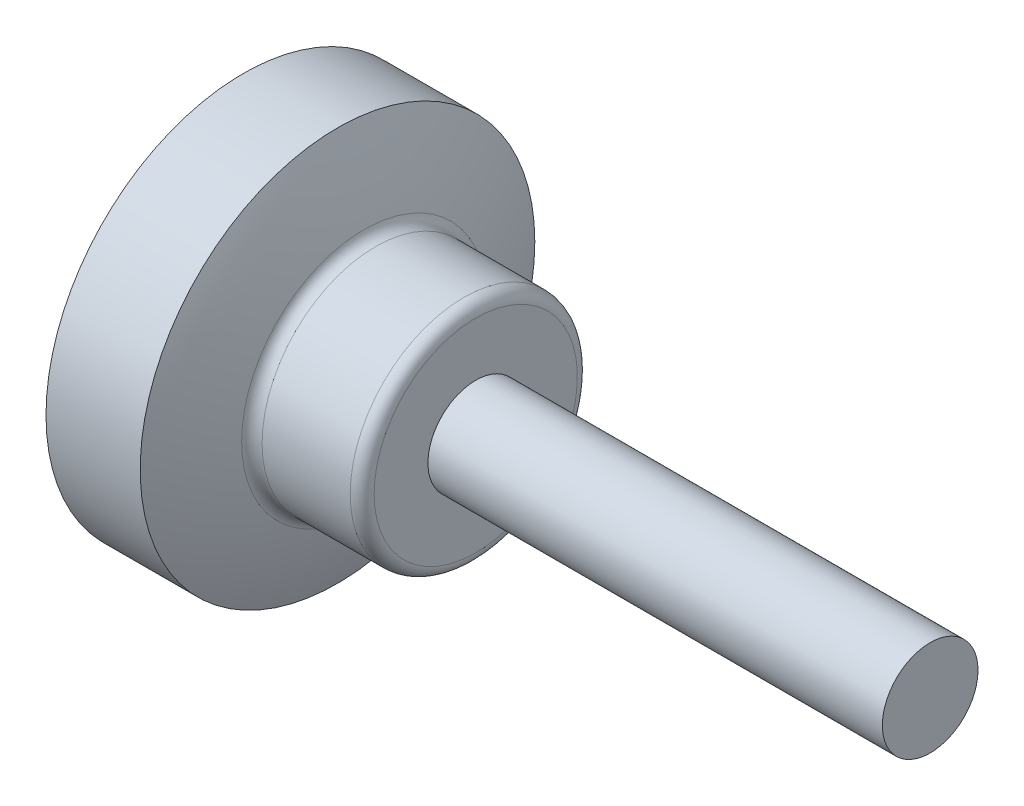
ISO-10303-21;
HEADER;
FILE_DESCRIPTION(('STEP AP214'),'2;1');
FILE_NAME('part.step','',(''),(''),'','','');
FILE_SCHEMA(('AUTOMOTIVE_DESIGN { 1 0 10303 214 1 1 1 1 }'));
ENDSEC;
DATA;
#1=APPLICATION_CONTEXT('core data for automotive mechanical design processes');
#2=APPLICATION_PROTOCOL_DEFINITION('international standard','automotive_design',2000,#1);
#3=PRODUCT_CONTEXT('',#1,'mechanical');
#4=PRODUCT('Part','Part','',(#3));
#5=PRODUCT_RELATED_PRODUCT_CATEGORY('part','',(#4));
#6=PRODUCT_DEFINITION_FORMATION('','',#4);
#7=PRODUCT_DEFINITION_CONTEXT('part definition',#1,'design');
#8=PRODUCT_DEFINITION('design','',#6,#7);
#9=PRODUCT_DEFINITION_SHAPE('','',#8);
#10=(LENGTH_UNIT() NAMED_UNIT(*) SI_UNIT(.MILLI.,.METRE.));
#11=(NAMED_UNIT(*) PLANE_ANGLE_UNIT() SI_UNIT($,.RADIAN.));
#12=(NAMED_UNIT(*) SI_UNIT($,.STERADIAN.) SOLID_ANGLE_UNIT());
#13=UNCERTAINTY_MEASURE_WITH_UNIT(LENGTH_MEASURE(1.E-05),#10,'distance_accuracy_value','');
#14=(GEOMETRIC_REPRESENTATION_CONTEXT(3) GLOBAL_UNCERTAINTY_ASSIGNED_CONTEXT((#13)) GLOBAL_UNIT_ASSIGNED_CONTEXT((#10,
#11,#12)) REPRESENTATION_CONTEXT('',''));
#15=CARTESIAN_POINT('',(0.,0.,0.));
#16=DIRECTION('',(0.,0.,1.));
#17=DIRECTION('',(1.,0.,0.));
#18=AXIS2_PLACEMENT_3D('',#15,#16,#17);
#19=CARTESIAN_POINT('',(61.,0.,0.));
#20=DIRECTION('',(-1.,0.,0.));
#21=DIRECTION('',(0.,0.,1.));
#22=AXIS2_PLACEMENT_3D('',#19,#20,#21);
#23=CYLINDRICAL_SURFACE('',#22,4.);
#24=CARTESIAN_POINT('',(61.,0.,0.));
#25=DIRECTION('',(1.,0.,0.));
#26=DIRECTION('',(0.,0.,-1.));
#27=AXIS2_PLACEMENT_3D('',#24,#25,#26);
#28=CIRCLE('',#27,4.);
#29=CARTESIAN_POINT('',(61.,0.,-4.));
#30=VERTEX_POINT('',#29);
#31=EDGE_CURVE('E11',#30,#30,#28,.T.);
#32=ORIENTED_EDGE('',*,*,#31,.F.);
#33=EDGE_LOOP('',(#32));
#34=FACE_BOUND('',#33,.T.);
#35=CARTESIAN_POINT('',(23.,0.,0.));
#36=DIRECTION('',(1.,0.,0.));
#37=DIRECTION('',(0.,0.,-1.));
#38=AXIS2_PLACEMENT_3D('',#35,#36,#37);
#39=CIRCLE('',#38,4.);
#40=CARTESIAN_POINT('',(23.,0.,-4.));
#41=VERTEX_POINT('',#40);
#42=EDGE_CURVE('E44',#41,#41,#39,.T.);
#43=ORIENTED_EDGE('',*,*,#42,.T.);
#44=EDGE_LOOP('',(#43));
#45=FACE_BOUND('',#44,.T.);
#46=ADVANCED_FACE('F41',(#34,#45),#23,.T.);
#47=CARTESIAN_POINT('',(61.,0.,0.));
#48=DIRECTION('',(1.,0.,0.));
#49=DIRECTION('',(0.,0.,-1.));
#50=AXIS2_PLACEMENT_3D('',#47,#48,#49);
#51=PLANE('',#50);
#52=ORIENTED_EDGE('',*,*,#31,.T.);
#53=EDGE_LOOP('',(#52));
#54=FACE_BOUND('',#53,.T.);
#55=ADVANCED_FACE('F56',(#54),#51,.T.);
#56=CARTESIAN_POINT('',(23.,0.,0.));
#57=DIRECTION('',(1.,0.,0.));
#58=DIRECTION('',(0.,0.,-1.));
#59=AXIS2_PLACEMENT_3D('',#56,#57,#58);
#60=PLANE('',#59);
#61=ORIENTED_EDGE('',*,*,#42,.F.);
#62=EDGE_LOOP('',(#61));
#63=FACE_BOUND('',#62,.T.);
#64=ADVANCED_FACE('F54',(#63),#60,.F.);
#65=CLOSED_SHELL('',(#46,#55,#64));
#66=MANIFOLD_SOLID_BREP('B2',#65);
#67=CARTESIAN_POINT('',(40.,0.,0.));
#68=DIRECTION('',(-1.,0.,0.));
#69=DIRECTION('',(0.,0.,-1.));
#70=AXIS2_PLACEMENT_3D('',#67,#68,#69);
#71=SPHERICAL_SURFACE('',#70,40.);
#72=CARTESIAN_POINT('',(3.5616959779959,0.,0.));
#73=DIRECTION('',(-1.,0.,0.));
#74=DIRECTION('',(0.,0.,1.));
#75=AXIS2_PLACEMENT_3D('',#72,#73,#74);
#76=CIRCLE('',#75,16.5);
#77=CARTESIAN_POINT('',(3.5616959779959,0.,16.5));
#78=VERTEX_POINT('',#77);
#79=EDGE_CURVE('E40',#78,#78,#76,.T.);
#80=ORIENTED_EDGE('',*,*,#79,.T.);
#81=EDGE_LOOP('',(#80));
#82=FACE_BOUND('',#81,.T.);
#83=ADVANCED_FACE('F82',(#82),#71,.T.);
#84=CARTESIAN_POINT('',(0.,0.,0.));
#85=DIRECTION('',(-1.,0.,0.));
#86=DIRECTION('',(0.,0.,1.));
#87=AXIS2_PLACEMENT_3D('',#84,#85,#86);
#88=CYLINDRICAL_SURFACE('',#87,16.5);
#89=ORIENTED_EDGE('',*,*,#79,.F.);
#90=EDGE_LOOP('',(#89));
#91=FACE_BOUND('',#90,.T.);
#92=CARTESIAN_POINT('',(11.4383040220041,0.,0.));
#93=DIRECTION('',(-1.,0.,0.));
#94=DIRECTION('',(0.,0.,1.));
#95=AXIS2_PLACEMENT_3D('',#92,#93,#94);
#96=CIRCLE('',#95,16.5);
#97=CARTESIAN_POINT('',(11.4383040220041,0.,-16.5));
#98=VERTEX_POINT('',#97);
#99=EDGE_CURVE('E88',#98,#98,#96,.T.);
#100=ORIENTED_EDGE('',*,*,#99,.T.);
#101=EDGE_LOOP('',(#100));
#102=FACE_BOUND('',#101,.T.);
#103=ADVANCED_FACE('F120',(#91,#102),#88,.T.);
#104=CARTESIAN_POINT('',(-25.,0.,0.));
#105=DIRECTION('',(-1.,0.,0.));
#106=DIRECTION('',(0.,0.,-1.));
#107=AXIS2_PLACEMENT_3D('',#104,#105,#106);
#108=SPHERICAL_SURFACE('',#107,40.);
#109=CARTESIAN_POINT('',(13.6660375888162,0.,0.));
#110=DIRECTION('',(-1.,0.,0.));
#111=DIRECTION('',(0.,0.,1.));
#112=AXIS2_PLACEMENT_3D('',#109,#110,#111);
#113=CIRCLE('',#112,10.2439024390244);
#114=CARTESIAN_POINT('',(13.6660375888162,0.,-10.2439024390243));
#115=VERTEX_POINT('',#114);
#116=EDGE_CURVE('E92',#115,#115,#113,.T.);
#117=CARTESIAN_POINT('',(11.4383040220041,0.,-16.5));
#118=CARTESIAN_POINT('',(11.4668720150123,0.,-16.4369109609196));
#119=CARTESIAN_POINT('',(11.4952761569736,0.,-16.3737477267931));
#120=CARTESIAN_POINT('',(11.5517559794634,0.,-16.2472745756783));
#121=CARTESIAN_POINT('',(11.5798316599918,0.,-16.1839646586899));
#122=CARTESIAN_POINT('',(11.6356538002768,0.,-16.0571998490816));
#123=CARTESIAN_POINT('',(11.6634002600334,0.,-15.9937449564616));
#124=CARTESIAN_POINT('',(11.7185632106921,0.,-15.8666919077922));
#125=CARTESIAN_POINT('',(11.7459797015944,0.,-15.8030937517427));
#126=CARTESIAN_POINT('',(11.8004819747283,0.,-15.6757558919973));
#127=CARTESIAN_POINT('',(11.8275677569601,0.,-15.6120161883013));
#128=CARTESIAN_POINT('',(11.8814078820295,0.,-15.4843969529411));
#129=CARTESIAN_POINT('',(11.9081622248673,0.,-15.4205174212768));
#130=CARTESIAN_POINT('',(11.9613387493218,0.,-15.2926202534101));
#131=CARTESIAN_POINT('',(11.9877609309385,0.,-15.2286026172077));
#132=CARTESIAN_POINT('',(12.0402724200977,0.,-15.1004309674263));
#133=CARTESIAN_POINT('',(12.0663617276402,0.,-15.0362769538474));
#134=CARTESIAN_POINT('',(12.118206764775,0.,-14.9078342801525));
#135=CARTESIAN_POINT('',(12.1439624943673,0.,-14.8435456200366));
#136=CARTESIAN_POINT('',(12.1951396807268,0.,-14.7148353877405));
#137=CARTESIAN_POINT('',(12.2205611374938,0.,-14.6504138155603));
#138=CARTESIAN_POINT('',(12.2710690923458,0.,-14.5214394971939));
#139=CARTESIAN_POINT('',(12.2961555904306,0.,-14.4568867510078));
#140=CARTESIAN_POINT('',(12.3459929510983,0.,-14.3276518262271));
#141=CARTESIAN_POINT('',(12.3707438136812,0.,-14.2629696476325));
#142=CARTESIAN_POINT('',(12.4199092355801,0.,-14.1334776031244));
#143=CARTESIAN_POINT('',(12.4443237948963,0.,-14.0686677372109));
#144=CARTESIAN_POINT('',(12.4928159515706,0.,-13.9389220665992));
#145=CARTESIAN_POINT('',(12.5168935489288,0.,-13.8739862619011));
#146=CARTESIAN_POINT('',(12.5647111320868,0.,-13.7439904656525));
#147=CARTESIAN_POINT('',(12.5884511178867,0.,-13.678930474102));
#148=CARTESIAN_POINT('',(12.6355928374365,0.,-13.5486880594312));
#149=CARTESIAN_POINT('',(12.6589945711864,0.,-13.4835056363109));
#150=CARTESIAN_POINT('',(12.7054591552704,0.,-13.3530201170863));
#151=CARTESIAN_POINT('',(12.7285220056044,0.,-13.2877170209821));
#152=CARTESIAN_POINT('',(12.7743082006337,0.,-13.1569919176311));
#153=CARTESIAN_POINT('',(12.797031545329,0.,-13.0915699103843));
#154=CARTESIAN_POINT('',(12.8421381160174,0.,-12.960608749798));
#155=CARTESIAN_POINT('',(12.8645213420105,0.,-12.8950695964584));
#156=CARTESIAN_POINT('',(12.9089470714076,0.,-12.7638759118965));
#157=CARTESIAN_POINT('',(12.9309895748116,0.,-12.6982213806742));
#158=CARTESIAN_POINT('',(12.9747332643357,0.,-12.5667987116699));
#159=CARTESIAN_POINT('',(12.9964344504559,0.,-12.5010305738879));
#160=CARTESIAN_POINT('',(13.0394949199266,0.,-12.3693824661523));
#161=CARTESIAN_POINT('',(13.060854203277,0.,-12.3035024961987));
#162=CARTESIAN_POINT('',(13.1032302909464,0.,-12.1716325015251));
#163=CARTESIAN_POINT('',(13.1242470952653,0.,-12.105642476805));
#164=CARTESIAN_POINT('',(13.1659376578501,0.,-11.973554152973));
#165=CARTESIAN_POINT('',(13.1866114161159,0.,-11.907455853861));
#166=CARTESIAN_POINT('',(13.2276153288275,0.,-11.7751527645405));
#167=CARTESIAN_POINT('',(13.2479454832733,0.,-11.7089479743321));
#168=CARTESIAN_POINT('',(13.2882616398493,0.,-11.5764336889877));
#169=CARTESIAN_POINT('',(13.3082476419796,0.,-11.5101241938518));
#170=CARTESIAN_POINT('',(13.3478749547105,0.,-11.3774022876452));
#171=CARTESIAN_POINT('',(13.3675162653111,0.,-11.3109898765745));
#172=CARTESIAN_POINT('',(13.4064536650812,0.,-11.1780639302715));
#173=CARTESIAN_POINT('',(13.4257497542507,0.,-11.1115503950391));
#174=CARTESIAN_POINT('',(13.4639961905227,0.,-10.9784239949007));
#175=CARTESIAN_POINT('',(13.4829465376252,0.,-10.9118111299947));
#176=CARTESIAN_POINT('',(13.5205009786353,0.,-10.7784878677258));
#177=CARTESIAN_POINT('',(13.539105072543,0.,-10.711777470363));
#178=CARTESIAN_POINT('',(13.5759665047048,0.,-10.5782609428467));
#179=CARTESIAN_POINT('',(13.594223842959,0.,-10.5114548126933));
#180=CARTESIAN_POINT('',(13.6303912732208,0.,-10.3777486225237));
#181=CARTESIAN_POINT('',(13.6483013652285,0.,-10.3108485625077));
#182=CARTESIAN_POINT('',(13.6660375888162,0.,-10.2439024390243));
#183=B_SPLINE_CURVE_WITH_KNOTS('',3,(#117,#118,#119,#120,#121,#122,#123,#124,#125,#126,#127,
#128,#129,#130,#131,#132,#133,#134,#135,#136,#137,#138,#139,#140,#141,#142,#143,#144,#145,#146,
#147,#148,#149,#150,#151,#152,#153,#154,#155,#156,#157,#158,#159,#160,#161,#162,#163,#164,#165,
#166,#167,#168,#169,#170,#171,#172,#173,#174,#175,#176,#177,#178,#179,#180,#181,#182),
.UNSPECIFIED.,.F.,.F.,(4,2,2,2,2,2,2,2,2,2,2,2,2,2,2,2,2,2,2,2,2,2,2,2,2,2,2,2,2,2,2,2,4),(0.,
0.207766976745709,0.415533953491422,0.623300930237129,0.831067906982841,1.03883488372856,
1.24660186047427,1.45436883721998,1.66213581396569,1.8699027907114,2.07766976745711,
2.28543674420282,2.49320372094853,2.70097069769424,2.90873767443995,3.11650465118566,
3.32427162793137,3.53203860467708,3.73980558142279,3.9475725581685,4.15533953491421,
4.36310651165993,4.57087348840564,4.77864046515135,4.98640744189706,5.19417441864277,
5.40194139538848,5.60970837213419,5.81747534887991,6.02524232562562,6.23300930237133,
6.44077627911704,6.64854325586275),.UNSPECIFIED.);
#184=EDGE_CURVE('BSEAM124',#98,#115,#183,.T.);
#185=ORIENTED_EDGE('',*,*,#99,.F.);
#186=ORIENTED_EDGE('',*,*,#116,.T.);
#187=ORIENTED_EDGE('',*,*,#184,.T.);
#188=ORIENTED_EDGE('',*,*,#184,.F.);
#189=EDGE_LOOP('',(#185,#187,#186,#188));
#190=FACE_BOUND('',#189,.T.);
#191=ADVANCED_FACE('F124',(#190),#108,.T.);
#192=CARTESIAN_POINT('',(14.6326885285367,0.,0.));
#193=DIRECTION('',(-1.,0.,0.));
#194=DIRECTION('',(0.,0.,1.));
#195=AXIS2_PLACEMENT_3D('',#192,#193,#194);
#196=TOROIDAL_SURFACE('',#195,10.5,1.00000000000001);
#197=ORIENTED_EDGE('',*,*,#116,.F.);
#198=EDGE_LOOP('',(#197));
#199=FACE_BOUND('',#198,.T.);
#200=CARTESIAN_POINT('',(14.6326885285367,0.,0.));
#201=DIRECTION('',(-1.,0.,0.));
#202=DIRECTION('',(0.,0.,1.));
#203=AXIS2_PLACEMENT_3D('',#200,#201,#202);
#204=CIRCLE('',#203,9.5);
#205=CARTESIAN_POINT('',(14.6326885285367,0.,9.5));
#206=VERTEX_POINT('',#205);
#207=EDGE_CURVE('E96',#206,#206,#204,.T.);
#208=ORIENTED_EDGE('',*,*,#207,.T.);
#209=EDGE_LOOP('',(#208));
#210=FACE_BOUND('',#209,.T.);
#211=ADVANCED_FACE('F129',(#199,#210),#196,.F.);
#212=CARTESIAN_POINT('',(0.,0.,0.));
#213=DIRECTION('',(-1.,0.,0.));
#214=DIRECTION('',(0.,0.,1.));
#215=AXIS2_PLACEMENT_3D('',#212,#213,#214);
#216=CYLINDRICAL_SURFACE('',#215,9.5);
#217=ORIENTED_EDGE('',*,*,#207,.F.);
#218=EDGE_LOOP('',(#217));
#219=FACE_BOUND('',#218,.T.);
#220=CARTESIAN_POINT('',(22.,0.,0.));
#221=DIRECTION('',(-1.,0.,0.));
#222=DIRECTION('',(0.,0.,1.));
#223=AXIS2_PLACEMENT_3D('',#220,#221,#222);
#224=CIRCLE('',#223,9.5);
#225=CARTESIAN_POINT('',(22.,0.,9.5));
#226=VERTEX_POINT('',#225);
#227=EDGE_CURVE('E101',#226,#226,#224,.T.);
#228=ORIENTED_EDGE('',*,*,#227,.T.);
#229=EDGE_LOOP('',(#228));
#230=FACE_BOUND('',#229,.T.);
#231=ADVANCED_FACE('F116',(#219,#230),#216,.T.);
#232=CARTESIAN_POINT('',(22.,0.,0.));
#233=DIRECTION('',(-1.,0.,0.));
#234=DIRECTION('',(0.,0.,1.));
#235=AXIS2_PLACEMENT_3D('',#232,#233,#234);
#236=TOROIDAL_SURFACE('',#235,8.5,1.);
#237=ORIENTED_EDGE('',*,*,#227,.F.);
#238=EDGE_LOOP('',(#237));
#239=FACE_BOUND('',#238,.T.);
#240=CARTESIAN_POINT('',(23.,0.,0.));
#241=DIRECTION('',(-1.,0.,0.));
#242=DIRECTION('',(0.,0.,1.));
#243=AXIS2_PLACEMENT_3D('',#240,#241,#242);
#244=CIRCLE('',#243,8.49999999999999);
#245=CARTESIAN_POINT('',(23.,0.,8.49999999999999));
#246=VERTEX_POINT('',#245);
#247=EDGE_CURVE('E104',#246,#246,#244,.T.);
#248=ORIENTED_EDGE('',*,*,#247,.T.);
#249=EDGE_LOOP('',(#248));
#250=FACE_BOUND('',#249,.T.);
#251=ADVANCED_FACE('F108',(#239,#250),#236,.T.);
#252=CARTESIAN_POINT('',(23.,0.,0.));
#253=DIRECTION('',(-1.,0.,0.));
#254=DIRECTION('',(0.,0.,1.));
#255=AXIS2_PLACEMENT_3D('',#252,#253,#254);
#256=PLANE('',#255);
#257=ORIENTED_EDGE('',*,*,#247,.F.);
#258=EDGE_LOOP('',(#257));
#259=FACE_BOUND('',#258,.T.);
#260=ADVANCED_FACE('F110',(#259),#256,.F.);
#261=CLOSED_SHELL('',(#83,#103,#191,#211,#231,#251,#260));
#262=MANIFOLD_SOLID_BREP('B6',#261);
#263=ADVANCED_BREP_SHAPE_REPRESENTATION('',(#18,#66,#262),#14);
#264=SHAPE_DEFINITION_REPRESENTATION(#9,#263);
ENDSEC;
END-ISO-10303-21;
